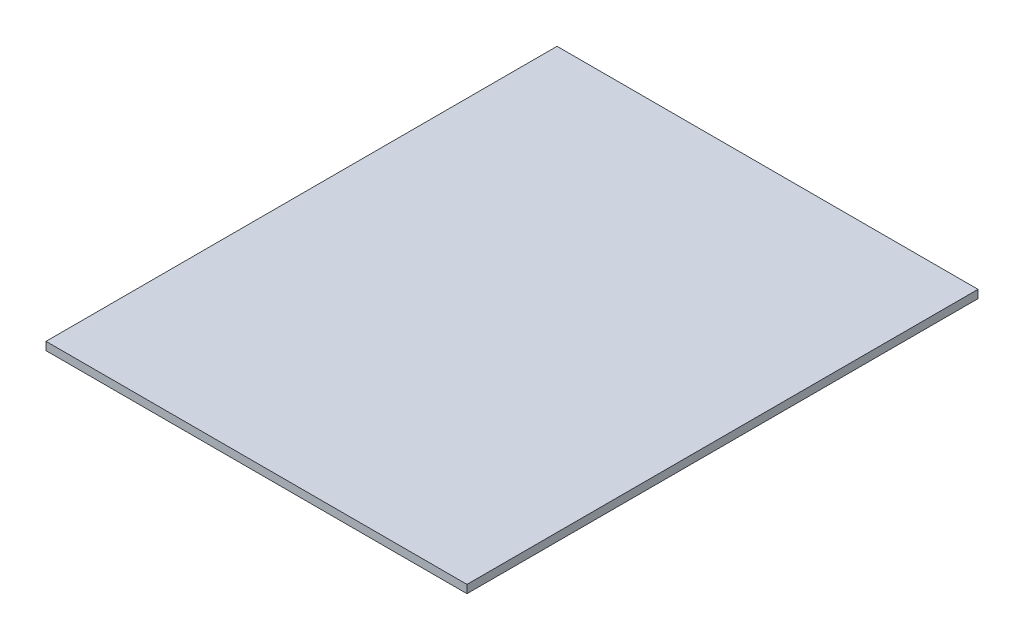
ISO-10303-21;
HEADER;
FILE_DESCRIPTION(('STEP AP214'),'2;1');
FILE_NAME('part.step','',(''),(''),'','','');
FILE_SCHEMA(('AUTOMOTIVE_DESIGN { 1 0 10303 214 1 1 1 1 }'));
ENDSEC;
DATA;
#1=APPLICATION_CONTEXT('core data for automotive mechanical design processes');
#2=APPLICATION_PROTOCOL_DEFINITION('international standard','automotive_design',2000,#1);
#3=PRODUCT_CONTEXT('',#1,'mechanical');
#4=PRODUCT('Part','Part','',(#3));
#5=PRODUCT_RELATED_PRODUCT_CATEGORY('part','',(#4));
#6=PRODUCT_DEFINITION_FORMATION('','',#4);
#7=PRODUCT_DEFINITION_CONTEXT('part definition',#1,'design');
#8=PRODUCT_DEFINITION('design','',#6,#7);
#9=PRODUCT_DEFINITION_SHAPE('','',#8);
#10=(LENGTH_UNIT() NAMED_UNIT(*) SI_UNIT(.MILLI.,.METRE.));
#11=(NAMED_UNIT(*) PLANE_ANGLE_UNIT() SI_UNIT($,.RADIAN.));
#12=(NAMED_UNIT(*) SI_UNIT($,.STERADIAN.) SOLID_ANGLE_UNIT());
#13=UNCERTAINTY_MEASURE_WITH_UNIT(LENGTH_MEASURE(1.E-05),#10,'distance_accuracy_value','');
#14=(GEOMETRIC_REPRESENTATION_CONTEXT(3) GLOBAL_UNCERTAINTY_ASSIGNED_CONTEXT((#13)) GLOBAL_UNIT_ASSIGNED_CONTEXT((#10,
#11,#12)) REPRESENTATION_CONTEXT('',''));
#15=CARTESIAN_POINT('',(0.,0.,0.));
#16=DIRECTION('',(0.,0.,1.));
#17=DIRECTION('',(1.,0.,0.));
#18=AXIS2_PLACEMENT_3D('',#15,#16,#17);
#19=CARTESIAN_POINT('',(714.,1608.,-757.5));
#20=DIRECTION('',(-1.,0.,0.));
#21=DIRECTION('',(0.,0.,1.));
#22=AXIS2_PLACEMENT_3D('',#19,#20,#21);
#23=PLANE('',#22);
#24=DIRECTION('',(0.,-1.,0.));
#25=VECTOR('',#24,1.);
#26=CARTESIAN_POINT('',(714.,1608.,0.));
#27=LINE('',#26,#25);
#28=CARTESIAN_POINT('',(714.,1620.,0.));
#29=VERTEX_POINT('',#28);
#30=CARTESIAN_POINT('',(714.,1608.,0.));
#31=VERTEX_POINT('',#30);
#32=EDGE_CURVE('E103',#29,#31,#27,.T.);
#33=ORIENTED_EDGE('',*,*,#32,.F.);
#34=DIRECTION('',(0.,0.,1.));
#35=VECTOR('',#34,1.);
#36=CARTESIAN_POINT('',(714.,1620.,-757.5));
#37=LINE('',#36,#35);
#38=CARTESIAN_POINT('',(714.,1620.,-757.5));
#39=VERTEX_POINT('',#38);
#40=EDGE_CURVE('E11',#39,#29,#37,.T.);
#41=ORIENTED_EDGE('',*,*,#40,.F.);
#42=DIRECTION('',(0.,-1.,0.));
#43=VECTOR('',#42,1.);
#44=CARTESIAN_POINT('',(714.,1608.,-757.5));
#45=LINE('',#44,#43);
#46=CARTESIAN_POINT('',(714.,1608.,-757.5));
#47=VERTEX_POINT('',#46);
#48=EDGE_CURVE('E97',#39,#47,#45,.T.);
#49=ORIENTED_EDGE('',*,*,#48,.T.);
#50=DIRECTION('',(0.,0.,1.));
#51=VECTOR('',#50,1.);
#52=CARTESIAN_POINT('',(714.,1608.,-757.5));
#53=LINE('',#52,#51);
#54=EDGE_CURVE('E42',#47,#31,#53,.T.);
#55=ORIENTED_EDGE('',*,*,#54,.T.);
#56=EDGE_LOOP('',(#33,#41,#49,#55));
#57=FACE_BOUND('',#56,.T.);
#58=ADVANCED_FACE('F39',(#57),#23,.T.);
#59=CARTESIAN_POINT('',(714.,1620.,-757.5));
#60=DIRECTION('',(0.,1.,0.));
#61=DIRECTION('',(0.,0.,1.));
#62=AXIS2_PLACEMENT_3D('',#59,#60,#61);
#63=PLANE('',#62);
#64=DIRECTION('',(-1.,0.,0.));
#65=VECTOR('',#64,1.);
#66=CARTESIAN_POINT('',(714.,1620.,0.));
#67=LINE('',#66,#65);
#68=CARTESIAN_POINT('',(1338.,1620.,0.));
#69=VERTEX_POINT('',#68);
#70=EDGE_CURVE('E99',#69,#29,#67,.T.);
#71=ORIENTED_EDGE('',*,*,#70,.F.);
#72=DIRECTION('',(0.,0.,1.));
#73=VECTOR('',#72,1.);
#74=CARTESIAN_POINT('',(1338.,1620.,-757.5));
#75=LINE('',#74,#73);
#76=CARTESIAN_POINT('',(1338.,1620.,-757.5));
#77=VERTEX_POINT('',#76);
#78=EDGE_CURVE('E48',#77,#69,#75,.T.);
#79=ORIENTED_EDGE('',*,*,#78,.F.);
#80=DIRECTION('',(-1.,0.,0.));
#81=VECTOR('',#80,1.);
#82=CARTESIAN_POINT('',(714.,1620.,-757.5));
#83=LINE('',#82,#81);
#84=EDGE_CURVE('E94',#77,#39,#83,.T.);
#85=ORIENTED_EDGE('',*,*,#84,.T.);
#86=ORIENTED_EDGE('',*,*,#40,.T.);
#87=EDGE_LOOP('',(#71,#79,#85,#86));
#88=FACE_BOUND('',#87,.T.);
#89=ADVANCED_FACE('F113',(#88),#63,.T.);
#90=CARTESIAN_POINT('',(1338.,1608.,-757.5));
#91=DIRECTION('',(1.,0.,0.));
#92=DIRECTION('',(0.,0.,-1.));
#93=AXIS2_PLACEMENT_3D('',#90,#91,#92);
#94=PLANE('',#93);
#95=DIRECTION('',(0.,1.,0.));
#96=VECTOR('',#95,1.);
#97=CARTESIAN_POINT('',(1338.,1608.,0.));
#98=LINE('',#97,#96);
#99=CARTESIAN_POINT('',(1338.,1608.,0.));
#100=VERTEX_POINT('',#99);
#101=EDGE_CURVE('E89',#100,#69,#98,.T.);
#102=ORIENTED_EDGE('',*,*,#101,.F.);
#103=DIRECTION('',(0.,0.,1.));
#104=VECTOR('',#103,1.);
#105=CARTESIAN_POINT('',(1338.,1608.,-757.5));
#106=LINE('',#105,#104);
#107=CARTESIAN_POINT('',(1338.,1608.,-757.5));
#108=VERTEX_POINT('',#107);
#109=EDGE_CURVE('E84',#108,#100,#106,.T.);
#110=ORIENTED_EDGE('',*,*,#109,.F.);
#111=DIRECTION('',(0.,1.,0.));
#112=VECTOR('',#111,1.);
#113=CARTESIAN_POINT('',(1338.,1608.,-757.5));
#114=LINE('',#113,#112);
#115=EDGE_CURVE('E87',#108,#77,#114,.T.);
#116=ORIENTED_EDGE('',*,*,#115,.T.);
#117=ORIENTED_EDGE('',*,*,#78,.T.);
#118=EDGE_LOOP('',(#102,#110,#116,#117));
#119=FACE_BOUND('',#118,.T.);
#120=ADVANCED_FACE('F86',(#119),#94,.T.);
#121=CARTESIAN_POINT('',(714.,1608.,-757.5));
#122=DIRECTION('',(0.,-1.,0.));
#123=DIRECTION('',(0.,0.,-1.));
#124=AXIS2_PLACEMENT_3D('',#121,#122,#123);
#125=PLANE('',#124);
#126=DIRECTION('',(1.,0.,0.));
#127=VECTOR('',#126,1.);
#128=CARTESIAN_POINT('',(714.,1608.,0.));
#129=LINE('',#128,#127);
#130=EDGE_CURVE('E106',#31,#100,#129,.T.);
#131=ORIENTED_EDGE('',*,*,#130,.F.);
#132=ORIENTED_EDGE('',*,*,#54,.F.);
#133=DIRECTION('',(1.,0.,0.));
#134=VECTOR('',#133,1.);
#135=CARTESIAN_POINT('',(714.,1608.,-757.5));
#136=LINE('',#135,#134);
#137=EDGE_CURVE('E93',#47,#108,#136,.T.);
#138=ORIENTED_EDGE('',*,*,#137,.T.);
#139=ORIENTED_EDGE('',*,*,#109,.T.);
#140=EDGE_LOOP('',(#131,#132,#138,#139));
#141=FACE_BOUND('',#140,.T.);
#142=ADVANCED_FACE('F96',(#141),#125,.T.);
#143=CARTESIAN_POINT('',(0.,0.,-757.5));
#144=DIRECTION('',(0.,0.,-1.));
#145=DIRECTION('',(-1.,0.,0.));
#146=AXIS2_PLACEMENT_3D('',#143,#144,#145);
#147=PLANE('',#146);
#148=ORIENTED_EDGE('',*,*,#48,.F.);
#149=ORIENTED_EDGE('',*,*,#84,.F.);
#150=ORIENTED_EDGE('',*,*,#115,.F.);
#151=ORIENTED_EDGE('',*,*,#137,.F.);
#152=EDGE_LOOP('',(#148,#149,#150,#151));
#153=FACE_BOUND('',#152,.T.);
#154=ADVANCED_FACE('F92',(#153),#147,.T.);
#155=CARTESIAN_POINT('',(0.,0.,0.));
#156=DIRECTION('',(0.,0.,-1.));
#157=DIRECTION('',(-1.,0.,0.));
#158=AXIS2_PLACEMENT_3D('',#155,#156,#157);
#159=PLANE('',#158);
#160=ORIENTED_EDGE('',*,*,#32,.T.);
#161=ORIENTED_EDGE('',*,*,#130,.T.);
#162=ORIENTED_EDGE('',*,*,#101,.T.);
#163=ORIENTED_EDGE('',*,*,#70,.T.);
#164=EDGE_LOOP('',(#160,#161,#162,#163));
#165=FACE_BOUND('',#164,.T.);
#166=ADVANCED_FACE('F112',(#165),#159,.F.);
#167=CLOSED_SHELL('',(#58,#89,#120,#142,#154,#166));
#168=MANIFOLD_SOLID_BREP('B2',#167);
#169=ADVANCED_BREP_SHAPE_REPRESENTATION('',(#18,#168),#14);
#170=SHAPE_DEFINITION_REPRESENTATION(#9,#169);
ENDSEC;
END-ISO-10303-21;
